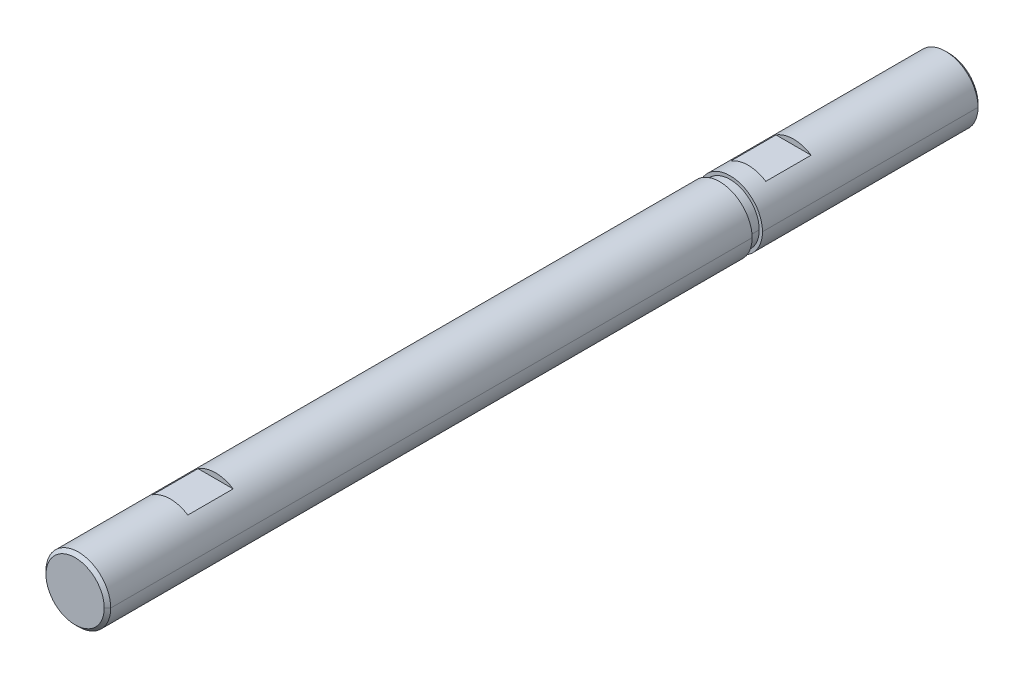
ISO-10303-21;
HEADER;
FILE_DESCRIPTION(('STEP AP214'),'2;1');
FILE_NAME('part.step','',(''),(''),'','','');
FILE_SCHEMA(('AUTOMOTIVE_DESIGN { 1 0 10303 214 1 1 1 1 }'));
ENDSEC;
DATA;
#1=APPLICATION_CONTEXT('core data for automotive mechanical design processes');
#2=APPLICATION_PROTOCOL_DEFINITION('international standard','automotive_design',2000,#1);
#3=PRODUCT_CONTEXT('',#1,'mechanical');
#4=PRODUCT('Part','Part','',(#3));
#5=PRODUCT_RELATED_PRODUCT_CATEGORY('part','',(#4));
#6=PRODUCT_DEFINITION_FORMATION('','',#4);
#7=PRODUCT_DEFINITION_CONTEXT('part definition',#1,'design');
#8=PRODUCT_DEFINITION('design','',#6,#7);
#9=PRODUCT_DEFINITION_SHAPE('','',#8);
#10=(LENGTH_UNIT() NAMED_UNIT(*) SI_UNIT(.MILLI.,.METRE.));
#11=(NAMED_UNIT(*) PLANE_ANGLE_UNIT() SI_UNIT($,.RADIAN.));
#12=(NAMED_UNIT(*) SI_UNIT($,.STERADIAN.) SOLID_ANGLE_UNIT());
#13=UNCERTAINTY_MEASURE_WITH_UNIT(LENGTH_MEASURE(1.E-05),#10,'distance_accuracy_value','');
#14=(GEOMETRIC_REPRESENTATION_CONTEXT(3) GLOBAL_UNCERTAINTY_ASSIGNED_CONTEXT((#13)) GLOBAL_UNIT_ASSIGNED_CONTEXT((#10,
#11,#12)) REPRESENTATION_CONTEXT('',''));
#15=CARTESIAN_POINT('',(0.,0.,0.));
#16=DIRECTION('',(0.,0.,1.));
#17=DIRECTION('',(1.,0.,0.));
#18=AXIS2_PLACEMENT_3D('',#15,#16,#17);
#19=CARTESIAN_POINT('',(0.,0.,67.5));
#20=DIRECTION('',(0.,0.,-1.));
#21=DIRECTION('',(-1.,0.,0.));
#22=AXIS2_PLACEMENT_3D('',#19,#20,#21);
#23=CYLINDRICAL_SURFACE('',#22,2.5);
#24=DIRECTION('',(0.,0.,-1.));
#25=VECTOR('',#24,1.);
#26=CARTESIAN_POINT('',(2.5,0.,67.5));
#27=LINE('',#26,#25);
#28=CARTESIAN_POINT('',(2.5,0.,16.9));
#29=VERTEX_POINT('',#28);
#30=CARTESIAN_POINT('',(2.5,0.,0.25));
#31=VERTEX_POINT('',#30);
#32=EDGE_CURVE('E181',#29,#31,#27,.T.);
#33=ORIENTED_EDGE('',*,*,#32,.F.);
#34=CARTESIAN_POINT('',(0.,0.,16.9));
#35=DIRECTION('',(0.,0.,-1.));
#36=DIRECTION('',(-1.,0.,0.));
#37=AXIS2_PLACEMENT_3D('',#34,#35,#36);
#38=CIRCLE('',#37,2.5);
#39=CARTESIAN_POINT('',(-2.5,0.,16.9));
#40=VERTEX_POINT('',#39);
#41=EDGE_CURVE('E160',#29,#40,#38,.T.);
#42=ORIENTED_EDGE('',*,*,#41,.T.);
#43=DIRECTION('',(0.,0.,-1.));
#44=VECTOR('',#43,1.);
#45=CARTESIAN_POINT('',(-2.5,0.,67.5));
#46=LINE('',#45,#44);
#47=CARTESIAN_POINT('',(-2.5,0.,0.25));
#48=VERTEX_POINT('',#47);
#49=EDGE_CURVE('E224',#40,#48,#46,.T.);
#50=ORIENTED_EDGE('',*,*,#49,.T.);
#51=CARTESIAN_POINT('',(0.,0.,0.25));
#52=DIRECTION('',(0.,0.,1.));
#53=DIRECTION('',(1.,0.,0.));
#54=AXIS2_PLACEMENT_3D('',#51,#52,#53);
#55=CIRCLE('',#54,2.5);
#56=EDGE_CURVE('E205',#48,#31,#55,.T.);
#57=ORIENTED_EDGE('',*,*,#56,.T.);
#58=EDGE_LOOP('',(#33,#42,#50,#57));
#59=FACE_BOUND('',#58,.T.);
#60=ADVANCED_FACE('F17',(#59),#23,.T.);
#61=CARTESIAN_POINT('',(-2.5,3.44225365935192,15.5));
#62=DIRECTION('',(0.,0.,1.));
#63=DIRECTION('',(1.,0.,0.));
#64=AXIS2_PLACEMENT_3D('',#61,#62,#63);
#65=PLANE('',#64);
#66=DIRECTION('',(1.,0.,0.));
#67=VECTOR('',#66,1.);
#68=CARTESIAN_POINT('',(-2.5,2.1,15.5));
#69=LINE('',#68,#67);
#70=CARTESIAN_POINT('',(-1.35646599662505,2.1,15.5));
#71=VERTEX_POINT('',#70);
#72=CARTESIAN_POINT('',(1.35646599662505,2.1,15.5));
#73=VERTEX_POINT('',#72);
#74=EDGE_CURVE('E11',#71,#73,#69,.T.);
#75=ORIENTED_EDGE('',*,*,#74,.F.);
#76=CARTESIAN_POINT('',(0.,0.,15.5));
#77=DIRECTION('',(0.,0.,1.));
#78=DIRECTION('',(1.,0.,0.));
#79=AXIS2_PLACEMENT_3D('',#76,#77,#78);
#80=CIRCLE('',#79,2.5);
#81=EDGE_CURVE('E220',#73,#71,#80,.T.);
#82=ORIENTED_EDGE('',*,*,#81,.F.);
#83=EDGE_LOOP('',(#75,#82));
#84=FACE_BOUND('',#83,.T.);
#85=ADVANCED_FACE('F304',(#84),#65,.F.);
#86=CARTESIAN_POINT('',(-2.5,2.1,15.5));
#87=DIRECTION('',(0.,-1.,0.));
#88=DIRECTION('',(0.,0.,-1.));
#89=AXIS2_PLACEMENT_3D('',#86,#87,#88);
#90=PLANE('',#89);
#91=ORIENTED_EDGE('',*,*,#74,.T.);
#92=DIRECTION('',(0.,0.,1.));
#93=VECTOR('',#92,1.);
#94=CARTESIAN_POINT('',(1.35646599662505,2.1,67.5));
#95=LINE('',#94,#93);
#96=CARTESIAN_POINT('',(1.35646599662505,2.1,12.));
#97=VERTEX_POINT('',#96);
#98=EDGE_CURVE('E187',#97,#73,#95,.T.);
#99=ORIENTED_EDGE('',*,*,#98,.F.);
#100=DIRECTION('',(1.,0.,0.));
#101=VECTOR('',#100,1.);
#102=CARTESIAN_POINT('',(-2.5,2.1,12.));
#103=LINE('',#102,#101);
#104=CARTESIAN_POINT('',(-1.35646599662505,2.1,12.));
#105=VERTEX_POINT('',#104);
#106=EDGE_CURVE('E28',#105,#97,#103,.T.);
#107=ORIENTED_EDGE('',*,*,#106,.F.);
#108=DIRECTION('',(0.,0.,-1.));
#109=VECTOR('',#108,1.);
#110=CARTESIAN_POINT('',(-1.35646599662505,2.1,67.5));
#111=LINE('',#110,#109);
#112=EDGE_CURVE('E188',#71,#105,#111,.T.);
#113=ORIENTED_EDGE('',*,*,#112,.F.);
#114=EDGE_LOOP('',(#91,#99,#107,#113));
#115=FACE_BOUND('',#114,.T.);
#116=ADVANCED_FACE('F311',(#115),#90,.F.);
#117=CARTESIAN_POINT('',(-2.5,3.44225365935192,12.));
#118=DIRECTION('',(0.,0.,-1.));
#119=DIRECTION('',(0.,-1.,0.));
#120=AXIS2_PLACEMENT_3D('',#117,#118,#119);
#121=PLANE('',#120);
#122=ORIENTED_EDGE('',*,*,#106,.T.);
#123=CARTESIAN_POINT('',(0.,0.,12.));
#124=DIRECTION('',(0.,0.,-1.));
#125=DIRECTION('',(-1.,0.,0.));
#126=AXIS2_PLACEMENT_3D('',#123,#124,#125);
#127=CIRCLE('',#126,2.5);
#128=EDGE_CURVE('E183',#105,#97,#127,.T.);
#129=ORIENTED_EDGE('',*,*,#128,.F.);
#130=EDGE_LOOP('',(#122,#129));
#131=FACE_BOUND('',#130,.T.);
#132=ADVANCED_FACE('F347',(#131),#121,.F.);
#133=CARTESIAN_POINT('',(0.,0.,0.25));
#134=DIRECTION('',(0.,0.,1.));
#135=DIRECTION('',(1.,0.,0.));
#136=AXIS2_PLACEMENT_3D('',#133,#134,#135);
#137=CONICAL_SURFACE('',#136,2.5,0.78539816339743);
#138=DIRECTION('',(-0.707106781186535,0.,0.70710678118656));
#139=VECTOR('',#138,1.);
#140=CARTESIAN_POINT('',(-2.5,0.,0.25));
#141=LINE('',#140,#139);
#142=CARTESIAN_POINT('',(-2.25,0.,0.));
#143=VERTEX_POINT('',#142);
#144=EDGE_CURVE('E239',#143,#48,#141,.T.);
#145=ORIENTED_EDGE('',*,*,#144,.F.);
#146=CARTESIAN_POINT('',(0.,0.,0.));
#147=DIRECTION('',(0.,0.,-1.));
#148=DIRECTION('',(1.,0.,0.));
#149=AXIS2_PLACEMENT_3D('',#146,#147,#148);
#150=CIRCLE('',#149,2.25);
#151=CARTESIAN_POINT('',(2.25,0.,0.));
#152=VERTEX_POINT('',#151);
#153=EDGE_CURVE('E159',#152,#143,#150,.T.);
#154=ORIENTED_EDGE('',*,*,#153,.F.);
#155=DIRECTION('',(0.707106781186535,0.,0.70710678118656));
#156=VECTOR('',#155,1.);
#157=CARTESIAN_POINT('',(2.5,0.,0.25));
#158=LINE('',#157,#156);
#159=EDGE_CURVE('E177',#152,#31,#158,.T.);
#160=ORIENTED_EDGE('',*,*,#159,.T.);
#161=ORIENTED_EDGE('',*,*,#56,.F.);
#162=EDGE_LOOP('',(#145,#154,#160,#161));
#163=FACE_BOUND('',#162,.T.);
#164=ADVANCED_FACE('F349',(#163),#137,.T.);
#165=CARTESIAN_POINT('',(0.,0.,0.));
#166=DIRECTION('',(0.,0.,1.));
#167=DIRECTION('',(1.,0.,0.));
#168=AXIS2_PLACEMENT_3D('',#165,#166,#167);
#169=PLANE('',#168);
#170=ORIENTED_EDGE('',*,*,#153,.T.);
#171=CARTESIAN_POINT('',(0.,0.,0.));
#172=DIRECTION('',(0.,0.,-1.));
#173=DIRECTION('',(1.,0.,0.));
#174=AXIS2_PLACEMENT_3D('',#171,#172,#173);
#175=CIRCLE('',#174,2.25);
#176=EDGE_CURVE('E198',#143,#152,#175,.T.);
#177=ORIENTED_EDGE('',*,*,#176,.T.);
#178=EDGE_LOOP('',(#170,#177));
#179=FACE_BOUND('',#178,.T.);
#180=ADVANCED_FACE('F353',(#179),#169,.F.);
#181=CARTESIAN_POINT('',(0.,0.,-3.375));
#182=DIRECTION('',(0.,0.,-1.));
#183=DIRECTION('',(-1.,0.,0.));
#184=AXIS2_PLACEMENT_3D('',#181,#182,#183);
#185=CYLINDRICAL_SURFACE('',#184,2.25);
#186=DIRECTION('',(0.,0.,-1.));
#187=VECTOR('',#186,1.);
#188=CARTESIAN_POINT('',(2.25,0.,-3.375));
#189=LINE('',#188,#187);
#190=CARTESIAN_POINT('',(2.25,0.,17.7));
#191=VERTEX_POINT('',#190);
#192=CARTESIAN_POINT('',(2.25,0.,16.9));
#193=VERTEX_POINT('',#192);
#194=EDGE_CURVE('E152',#191,#193,#189,.T.);
#195=ORIENTED_EDGE('',*,*,#194,.F.);
#196=CARTESIAN_POINT('',(0.,0.,17.7));
#197=DIRECTION('',(0.,0.,-1.));
#198=DIRECTION('',(-1.,0.,0.));
#199=AXIS2_PLACEMENT_3D('',#196,#197,#198);
#200=CIRCLE('',#199,2.25);
#201=CARTESIAN_POINT('',(-2.25,0.,17.7));
#202=VERTEX_POINT('',#201);
#203=EDGE_CURVE('E271',#191,#202,#200,.T.);
#204=ORIENTED_EDGE('',*,*,#203,.T.);
#205=DIRECTION('',(0.,0.,-1.));
#206=VECTOR('',#205,1.);
#207=CARTESIAN_POINT('',(-2.25,0.,-3.375));
#208=LINE('',#207,#206);
#209=CARTESIAN_POINT('',(-2.25,0.,16.9));
#210=VERTEX_POINT('',#209);
#211=EDGE_CURVE('E155',#202,#210,#208,.T.);
#212=ORIENTED_EDGE('',*,*,#211,.T.);
#213=CARTESIAN_POINT('',(0.,0.,16.9));
#214=DIRECTION('',(0.,0.,-1.));
#215=DIRECTION('',(-1.,0.,0.));
#216=AXIS2_PLACEMENT_3D('',#213,#214,#215);
#217=CIRCLE('',#216,2.25);
#218=EDGE_CURVE('E148',#193,#210,#217,.T.);
#219=ORIENTED_EDGE('',*,*,#218,.F.);
#220=EDGE_LOOP('',(#195,#204,#212,#219));
#221=FACE_BOUND('',#220,.T.);
#222=ADVANCED_FACE('F150',(#221),#185,.T.);
#223=CARTESIAN_POINT('',(0.,3.40150918049305,16.9));
#224=DIRECTION('',(0.,0.,-1.));
#225=DIRECTION('',(0.,-1.,0.));
#226=AXIS2_PLACEMENT_3D('',#223,#224,#225);
#227=PLANE('',#226);
#228=CARTESIAN_POINT('',(0.,0.,16.9));
#229=DIRECTION('',(0.,0.,-1.));
#230=DIRECTION('',(-1.,0.,0.));
#231=AXIS2_PLACEMENT_3D('',#228,#229,#230);
#232=CIRCLE('',#231,2.25);
#233=EDGE_CURVE('E162',#210,#193,#232,.T.);
#234=ORIENTED_EDGE('',*,*,#233,.T.);
#235=ORIENTED_EDGE('',*,*,#218,.T.);
#236=EDGE_LOOP('',(#234,#235));
#237=FACE_BOUND('',#236,.T.);
#238=CARTESIAN_POINT('',(0.,0.,16.9));
#239=DIRECTION('',(0.,0.,-1.));
#240=DIRECTION('',(-1.,0.,0.));
#241=AXIS2_PLACEMENT_3D('',#238,#239,#240);
#242=CIRCLE('',#241,2.5);
#243=EDGE_CURVE('E199',#40,#29,#242,.T.);
#244=ORIENTED_EDGE('',*,*,#243,.F.);
#245=ORIENTED_EDGE('',*,*,#41,.F.);
#246=EDGE_LOOP('',(#244,#245));
#247=FACE_BOUND('',#246,.T.);
#248=ADVANCED_FACE('F163',(#237,#247),#227,.F.);
#249=CARTESIAN_POINT('',(0.,3.40150918049305,17.7));
#250=DIRECTION('',(0.,0.,1.));
#251=DIRECTION('',(1.,0.,0.));
#252=AXIS2_PLACEMENT_3D('',#249,#250,#251);
#253=PLANE('',#252);
#254=CARTESIAN_POINT('',(0.,0.,17.7));
#255=DIRECTION('',(0.,0.,-1.));
#256=DIRECTION('',(-1.,0.,0.));
#257=AXIS2_PLACEMENT_3D('',#254,#255,#256);
#258=CIRCLE('',#257,2.25);
#259=EDGE_CURVE('E170',#202,#191,#258,.T.);
#260=ORIENTED_EDGE('',*,*,#259,.F.);
#261=ORIENTED_EDGE('',*,*,#203,.F.);
#262=EDGE_LOOP('',(#260,#261));
#263=FACE_BOUND('',#262,.T.);
#264=CARTESIAN_POINT('',(0.,0.,17.7));
#265=DIRECTION('',(0.,0.,1.));
#266=DIRECTION('',(1.,0.,0.));
#267=AXIS2_PLACEMENT_3D('',#264,#265,#266);
#268=CIRCLE('',#267,2.5);
#269=CARTESIAN_POINT('',(-2.5,0.,17.7));
#270=VERTEX_POINT('',#269);
#271=CARTESIAN_POINT('',(2.5,0.,17.7));
#272=VERTEX_POINT('',#271);
#273=EDGE_CURVE('E21',#270,#272,#268,.T.);
#274=ORIENTED_EDGE('',*,*,#273,.F.);
#275=CARTESIAN_POINT('',(0.,0.,17.7));
#276=DIRECTION('',(0.,0.,1.));
#277=DIRECTION('',(1.,0.,0.));
#278=AXIS2_PLACEMENT_3D('',#275,#276,#277);
#279=CIRCLE('',#278,2.5);
#280=EDGE_CURVE('E225',#272,#270,#279,.T.);
#281=ORIENTED_EDGE('',*,*,#280,.F.);
#282=EDGE_LOOP('',(#274,#281));
#283=FACE_BOUND('',#282,.T.);
#284=ADVANCED_FACE('F300',(#263,#283),#253,.F.);
#285=CARTESIAN_POINT('',(-2.5,2.1,60.15));
#286=DIRECTION('',(0.,-1.,0.));
#287=DIRECTION('',(0.,0.,-1.));
#288=AXIS2_PLACEMENT_3D('',#285,#286,#287);
#289=PLANE('',#288);
#290=DIRECTION('',(1.,0.,0.));
#291=VECTOR('',#290,1.);
#292=CARTESIAN_POINT('',(-2.5,2.1,60.15));
#293=LINE('',#292,#291);
#294=CARTESIAN_POINT('',(-1.35646599662505,2.1,60.15));
#295=VERTEX_POINT('',#294);
#296=CARTESIAN_POINT('',(1.35646599662505,2.1,60.15));
#297=VERTEX_POINT('',#296);
#298=EDGE_CURVE('E255',#295,#297,#293,.T.);
#299=ORIENTED_EDGE('',*,*,#298,.T.);
#300=DIRECTION('',(0.,0.,1.));
#301=VECTOR('',#300,1.);
#302=CARTESIAN_POINT('',(1.35646599662505,2.1,67.5));
#303=LINE('',#302,#301);
#304=CARTESIAN_POINT('',(1.35646599662505,2.1,56.65));
#305=VERTEX_POINT('',#304);
#306=EDGE_CURVE('E210',#305,#297,#303,.T.);
#307=ORIENTED_EDGE('',*,*,#306,.F.);
#308=DIRECTION('',(1.,0.,0.));
#309=VECTOR('',#308,1.);
#310=CARTESIAN_POINT('',(-2.5,2.1,56.65));
#311=LINE('',#310,#309);
#312=CARTESIAN_POINT('',(-1.35646599662505,2.1,56.65));
#313=VERTEX_POINT('',#312);
#314=EDGE_CURVE('E42',#313,#305,#311,.T.);
#315=ORIENTED_EDGE('',*,*,#314,.F.);
#316=DIRECTION('',(0.,0.,-1.));
#317=VECTOR('',#316,1.);
#318=CARTESIAN_POINT('',(-1.35646599662505,2.1,67.5));
#319=LINE('',#318,#317);
#320=EDGE_CURVE('E193',#295,#313,#319,.T.);
#321=ORIENTED_EDGE('',*,*,#320,.F.);
#322=EDGE_LOOP('',(#299,#307,#315,#321));
#323=FACE_BOUND('',#322,.T.);
#324=ADVANCED_FACE('F284',(#323),#289,.F.);
#325=CARTESIAN_POINT('',(-2.5,3.44225365935192,56.65));
#326=DIRECTION('',(0.,0.,-1.));
#327=DIRECTION('',(0.,-1.,0.));
#328=AXIS2_PLACEMENT_3D('',#325,#326,#327);
#329=PLANE('',#328);
#330=ORIENTED_EDGE('',*,*,#314,.T.);
#331=CARTESIAN_POINT('',(0.,0.,56.65));
#332=DIRECTION('',(0.,0.,-1.));
#333=DIRECTION('',(-1.,0.,0.));
#334=AXIS2_PLACEMENT_3D('',#331,#332,#333);
#335=CIRCLE('',#334,2.5);
#336=EDGE_CURVE('E206',#313,#305,#335,.T.);
#337=ORIENTED_EDGE('',*,*,#336,.F.);
#338=EDGE_LOOP('',(#330,#337));
#339=FACE_BOUND('',#338,.T.);
#340=ADVANCED_FACE('F287',(#339),#329,.F.);
#341=CARTESIAN_POINT('',(-2.5,3.44225365935192,60.15));
#342=DIRECTION('',(0.,0.,1.));
#343=DIRECTION('',(1.,0.,0.));
#344=AXIS2_PLACEMENT_3D('',#341,#342,#343);
#345=PLANE('',#344);
#346=ORIENTED_EDGE('',*,*,#298,.F.);
#347=CARTESIAN_POINT('',(0.,0.,60.15));
#348=DIRECTION('',(0.,0.,1.));
#349=DIRECTION('',(1.,0.,0.));
#350=AXIS2_PLACEMENT_3D('',#347,#348,#349);
#351=CIRCLE('',#350,2.5);
#352=EDGE_CURVE('E189',#297,#295,#351,.T.);
#353=ORIENTED_EDGE('',*,*,#352,.F.);
#354=EDGE_LOOP('',(#346,#353));
#355=FACE_BOUND('',#354,.T.);
#356=ADVANCED_FACE('F289',(#355),#345,.F.);
#357=CARTESIAN_POINT('',(0.,0.,67.5));
#358=DIRECTION('',(0.,0.,-1.));
#359=DIRECTION('',(-1.,0.,0.));
#360=AXIS2_PLACEMENT_3D('',#357,#358,#359);
#361=CONICAL_SURFACE('',#360,2.25,0.785398163397457);
#362=DIRECTION('',(0.707106781186554,0.,-0.707106781186541));
#363=VECTOR('',#362,1.);
#364=CARTESIAN_POINT('',(2.25,0.,67.5));
#365=LINE('',#364,#363);
#366=CARTESIAN_POINT('',(2.25,0.,67.5));
#367=VERTEX_POINT('',#366);
#368=CARTESIAN_POINT('',(2.5,0.,67.25));
#369=VERTEX_POINT('',#368);
#370=EDGE_CURVE('E214',#367,#369,#365,.T.);
#371=ORIENTED_EDGE('',*,*,#370,.F.);
#372=CARTESIAN_POINT('',(0.,0.,67.5));
#373=DIRECTION('',(0.,0.,1.));
#374=DIRECTION('',(1.,0.,0.));
#375=AXIS2_PLACEMENT_3D('',#372,#373,#374);
#376=CIRCLE('',#375,2.25);
#377=CARTESIAN_POINT('',(-2.25,0.,67.5));
#378=VERTEX_POINT('',#377);
#379=EDGE_CURVE('E259',#378,#367,#376,.T.);
#380=ORIENTED_EDGE('',*,*,#379,.F.);
#381=DIRECTION('',(-0.707106781186554,0.,-0.707106781186541));
#382=VECTOR('',#381,1.);
#383=CARTESIAN_POINT('',(-2.25,0.,67.5));
#384=LINE('',#383,#382);
#385=CARTESIAN_POINT('',(-2.5,0.,67.25));
#386=VERTEX_POINT('',#385);
#387=EDGE_CURVE('E251',#378,#386,#384,.T.);
#388=ORIENTED_EDGE('',*,*,#387,.T.);
#389=CARTESIAN_POINT('',(0.,0.,67.25));
#390=DIRECTION('',(0.,0.,-1.));
#391=DIRECTION('',(1.,0.,0.));
#392=AXIS2_PLACEMENT_3D('',#389,#390,#391);
#393=CIRCLE('',#392,2.5);
#394=EDGE_CURVE('E135',#369,#386,#393,.T.);
#395=ORIENTED_EDGE('',*,*,#394,.F.);
#396=EDGE_LOOP('',(#371,#380,#388,#395));
#397=FACE_BOUND('',#396,.T.);
#398=ADVANCED_FACE('F297',(#397),#361,.T.);
#399=CARTESIAN_POINT('',(0.,0.,67.5));
#400=DIRECTION('',(0.,0.,1.));
#401=DIRECTION('',(1.,0.,0.));
#402=AXIS2_PLACEMENT_3D('',#399,#400,#401);
#403=PLANE('',#402);
#404=ORIENTED_EDGE('',*,*,#379,.T.);
#405=CARTESIAN_POINT('',(0.,0.,67.5));
#406=DIRECTION('',(0.,0.,1.));
#407=DIRECTION('',(1.,0.,0.));
#408=AXIS2_PLACEMENT_3D('',#405,#406,#407);
#409=CIRCLE('',#408,2.25);
#410=EDGE_CURVE('E219',#367,#378,#409,.T.);
#411=ORIENTED_EDGE('',*,*,#410,.T.);
#412=EDGE_LOOP('',(#404,#411));
#413=FACE_BOUND('',#412,.T.);
#414=ADVANCED_FACE('F19',(#413),#403,.T.);
#415=CARTESIAN_POINT('',(0.,0.,67.5));
#416=DIRECTION('',(0.,0.,-1.));
#417=DIRECTION('',(-1.,0.,0.));
#418=AXIS2_PLACEMENT_3D('',#415,#416,#417);
#419=CYLINDRICAL_SURFACE('',#418,2.5);
#420=DIRECTION('',(0.,0.,-1.));
#421=VECTOR('',#420,1.);
#422=CARTESIAN_POINT('',(2.5,0.,67.5));
#423=LINE('',#422,#421);
#424=EDGE_CURVE('E229',#369,#272,#423,.T.);
#425=ORIENTED_EDGE('',*,*,#424,.F.);
#426=ORIENTED_EDGE('',*,*,#394,.T.);
#427=DIRECTION('',(0.,0.,-1.));
#428=VECTOR('',#427,1.);
#429=CARTESIAN_POINT('',(-2.5,0.,67.5));
#430=LINE('',#429,#428);
#431=EDGE_CURVE('E194',#386,#270,#430,.T.);
#432=ORIENTED_EDGE('',*,*,#431,.T.);
#433=ORIENTED_EDGE('',*,*,#273,.T.);
#434=EDGE_LOOP('',(#425,#426,#432,#433));
#435=FACE_BOUND('',#434,.T.);
#436=ADVANCED_FACE('F322',(#435),#419,.T.);
#437=CARTESIAN_POINT('',(0.,0.,67.5));
#438=DIRECTION('',(0.,0.,-1.));
#439=DIRECTION('',(-1.,0.,0.));
#440=AXIS2_PLACEMENT_3D('',#437,#438,#439);
#441=CYLINDRICAL_SURFACE('',#440,2.5);
#442=ORIENTED_EDGE('',*,*,#352,.T.);
#443=ORIENTED_EDGE('',*,*,#320,.T.);
#444=ORIENTED_EDGE('',*,*,#336,.T.);
#445=ORIENTED_EDGE('',*,*,#306,.T.);
#446=EDGE_LOOP('',(#442,#443,#444,#445));
#447=FACE_BOUND('',#446,.T.);
#448=CARTESIAN_POINT('',(0.,0.,67.25));
#449=DIRECTION('',(0.,0.,-1.));
#450=DIRECTION('',(1.,0.,0.));
#451=AXIS2_PLACEMENT_3D('',#448,#449,#450);
#452=CIRCLE('',#451,2.5);
#453=EDGE_CURVE('E218',#386,#369,#452,.T.);
#454=ORIENTED_EDGE('',*,*,#453,.T.);
#455=ORIENTED_EDGE('',*,*,#424,.T.);
#456=ORIENTED_EDGE('',*,*,#280,.T.);
#457=ORIENTED_EDGE('',*,*,#431,.F.);
#458=EDGE_LOOP('',(#454,#455,#456,#457));
#459=FACE_BOUND('',#458,.T.);
#460=ADVANCED_FACE('F280',(#447,#459),#441,.T.);
#461=CARTESIAN_POINT('',(0.,0.,67.5));
#462=DIRECTION('',(0.,0.,-1.));
#463=DIRECTION('',(-1.,0.,0.));
#464=AXIS2_PLACEMENT_3D('',#461,#462,#463);
#465=CONICAL_SURFACE('',#464,2.25,0.785398163397457);
#466=ORIENTED_EDGE('',*,*,#410,.F.);
#467=ORIENTED_EDGE('',*,*,#370,.T.);
#468=ORIENTED_EDGE('',*,*,#453,.F.);
#469=ORIENTED_EDGE('',*,*,#387,.F.);
#470=EDGE_LOOP('',(#466,#467,#468,#469));
#471=FACE_BOUND('',#470,.T.);
#472=ADVANCED_FACE('F328',(#471),#465,.T.);
#473=CARTESIAN_POINT('',(0.,0.,-3.375));
#474=DIRECTION('',(0.,0.,-1.));
#475=DIRECTION('',(-1.,0.,0.));
#476=AXIS2_PLACEMENT_3D('',#473,#474,#475);
#477=CYLINDRICAL_SURFACE('',#476,2.25);
#478=ORIENTED_EDGE('',*,*,#259,.T.);
#479=ORIENTED_EDGE('',*,*,#194,.T.);
#480=ORIENTED_EDGE('',*,*,#233,.F.);
#481=ORIENTED_EDGE('',*,*,#211,.F.);
#482=EDGE_LOOP('',(#478,#479,#480,#481));
#483=FACE_BOUND('',#482,.T.);
#484=ADVANCED_FACE('F168',(#483),#477,.T.);
#485=CARTESIAN_POINT('',(0.,0.,0.25));
#486=DIRECTION('',(0.,0.,1.));
#487=DIRECTION('',(1.,0.,0.));
#488=AXIS2_PLACEMENT_3D('',#485,#486,#487);
#489=CONICAL_SURFACE('',#488,2.5,0.78539816339743);
#490=ORIENTED_EDGE('',*,*,#176,.F.);
#491=ORIENTED_EDGE('',*,*,#144,.T.);
#492=CARTESIAN_POINT('',(0.,0.,0.25));
#493=DIRECTION('',(0.,0.,1.));
#494=DIRECTION('',(1.,0.,0.));
#495=AXIS2_PLACEMENT_3D('',#492,#493,#494);
#496=CIRCLE('',#495,2.5);
#497=EDGE_CURVE('E238',#31,#48,#496,.T.);
#498=ORIENTED_EDGE('',*,*,#497,.F.);
#499=ORIENTED_EDGE('',*,*,#159,.F.);
#500=EDGE_LOOP('',(#490,#491,#498,#499));
#501=FACE_BOUND('',#500,.T.);
#502=ADVANCED_FACE('F320',(#501),#489,.T.);
#503=CARTESIAN_POINT('',(0.,0.,67.5));
#504=DIRECTION('',(0.,0.,-1.));
#505=DIRECTION('',(-1.,0.,0.));
#506=AXIS2_PLACEMENT_3D('',#503,#504,#505);
#507=CYLINDRICAL_SURFACE('',#506,2.5);
#508=ORIENTED_EDGE('',*,*,#81,.T.);
#509=ORIENTED_EDGE('',*,*,#112,.T.);
#510=ORIENTED_EDGE('',*,*,#128,.T.);
#511=ORIENTED_EDGE('',*,*,#98,.T.);
#512=EDGE_LOOP('',(#508,#509,#510,#511));
#513=FACE_BOUND('',#512,.T.);
#514=ORIENTED_EDGE('',*,*,#243,.T.);
#515=ORIENTED_EDGE('',*,*,#32,.T.);
#516=ORIENTED_EDGE('',*,*,#497,.T.);
#517=ORIENTED_EDGE('',*,*,#49,.F.);
#518=EDGE_LOOP('',(#514,#515,#516,#517));
#519=FACE_BOUND('',#518,.T.);
#520=ADVANCED_FACE('F317',(#513,#519),#507,.T.);
#521=CLOSED_SHELL('',(#60,#85,#116,#132,#164,#180,#222,#248,#284,#324,#340,#356,#398,#414,#436,
#460,#472,#484,#502,#520));
#522=MANIFOLD_SOLID_BREP('B1',#521);
#523=ADVANCED_BREP_SHAPE_REPRESENTATION('',(#18,#522),#14);
#524=SHAPE_DEFINITION_REPRESENTATION(#9,#523);
ENDSEC;
END-ISO-10303-21;
